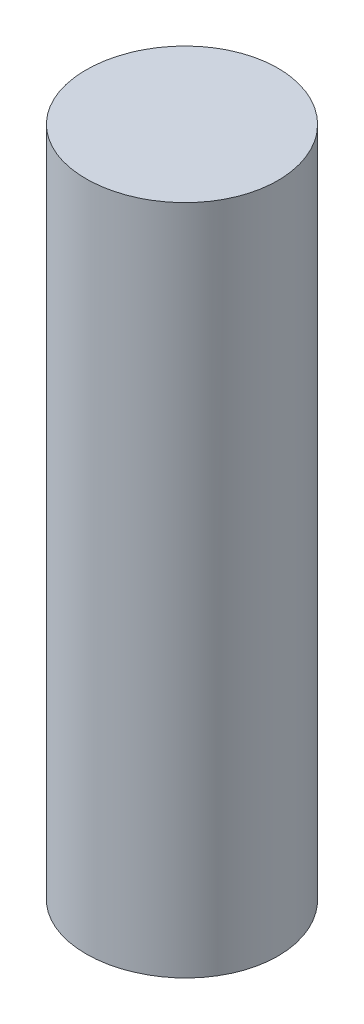
ISO-10303-21;
HEADER;
FILE_DESCRIPTION(('STEP AP214'),'2;1');
FILE_NAME('part.step','',(''),(''),'','','');
FILE_SCHEMA(('AUTOMOTIVE_DESIGN { 1 0 10303 214 1 1 1 1 }'));
ENDSEC;
DATA;
#1=APPLICATION_CONTEXT('core data for automotive mechanical design processes');
#2=APPLICATION_PROTOCOL_DEFINITION('international standard','automotive_design',2000,#1);
#3=PRODUCT_CONTEXT('',#1,'mechanical');
#4=PRODUCT('Part','Part','',(#3));
#5=PRODUCT_RELATED_PRODUCT_CATEGORY('part','',(#4));
#6=PRODUCT_DEFINITION_FORMATION('','',#4);
#7=PRODUCT_DEFINITION_CONTEXT('part definition',#1,'design');
#8=PRODUCT_DEFINITION('design','',#6,#7);
#9=PRODUCT_DEFINITION_SHAPE('','',#8);
#10=(LENGTH_UNIT() NAMED_UNIT(*) SI_UNIT(.MILLI.,.METRE.));
#11=(NAMED_UNIT(*) PLANE_ANGLE_UNIT() SI_UNIT($,.RADIAN.));
#12=(NAMED_UNIT(*) SI_UNIT($,.STERADIAN.) SOLID_ANGLE_UNIT());
#13=UNCERTAINTY_MEASURE_WITH_UNIT(LENGTH_MEASURE(1.E-05),#10,'distance_accuracy_value','');
#14=(GEOMETRIC_REPRESENTATION_CONTEXT(3) GLOBAL_UNCERTAINTY_ASSIGNED_CONTEXT((#13)) GLOBAL_UNIT_ASSIGNED_CONTEXT((#10,
#11,#12)) REPRESENTATION_CONTEXT('',''));
#15=CARTESIAN_POINT('',(0.,0.,0.));
#16=DIRECTION('',(0.,0.,1.));
#17=DIRECTION('',(1.,0.,0.));
#18=AXIS2_PLACEMENT_3D('',#15,#16,#17);
#19=CARTESIAN_POINT('',(0.,6.35,0.));
#20=DIRECTION('',(0.,-1.,0.));
#21=DIRECTION('',(0.,0.,-1.));
#22=AXIS2_PLACEMENT_3D('',#19,#20,#21);
#23=CYLINDRICAL_SURFACE('',#22,1.5875);
#24=CARTESIAN_POINT('',(0.,-5.47106576891905,-1.5875));
#25=CARTESIAN_POINT('',(-0.0891323258774931,-5.4710661953847,-1.58749605921527));
#26=CARTESIAN_POINT('',(-0.178328373062082,-5.47136925503878,-1.57996811463678));
#27=CARTESIAN_POINT('',(-0.354261339120677,-5.47254908556975,-1.55004358341553));
#28=CARTESIAN_POINT('',(-0.440995210390261,-5.47342653764656,-1.52762934192887));
#29=CARTESIAN_POINT('',(-0.609429708186872,-5.47565580852243,-1.46857367120603));
#30=CARTESIAN_POINT('',(-0.691132818553821,-5.47700739098507,-1.43193932919538));
#31=CARTESIAN_POINT('',(-0.847207157341417,-5.48003256982366,-1.34549385962703));
#32=CARTESIAN_POINT('',(-0.921580143809968,-5.48170608870116,-1.29568590222098));
#33=CARTESIAN_POINT('',(-1.0609575729247,-5.48518808834423,-1.18426756590865));
#34=CARTESIAN_POINT('',(-1.12595633295991,-5.48699664997237,-1.12265008038632));
#35=CARTESIAN_POINT('',(-1.24469203792854,-5.49054419499562,-0.989375322308569));
#36=CARTESIAN_POINT('',(-1.29842852936165,-5.4922831755866,-0.917717645656283));
#37=CARTESIAN_POINT('',(-1.39312750623152,-5.49549596912407,-0.766369973205105));
#38=CARTESIAN_POINT('',(-1.43408593057142,-5.49696969770592,-0.686677434410227));
#39=CARTESIAN_POINT('',(-1.50203994471335,-5.49948490244047,-0.521540196848319));
#40=CARTESIAN_POINT('',(-1.5290356123334,-5.50052638100219,-0.436095530142374));
#41=CARTESIAN_POINT('',(-1.56828381413217,-5.50205896658109,-0.26192837544394));
#42=CARTESIAN_POINT('',(-1.58054430220603,-5.50255037051293,-0.173207682499411));
#43=CARTESIAN_POINT('',(-1.58999864063167,-5.50292828793691,0.00503382120450027));
#44=CARTESIAN_POINT('',(-1.58719257681864,-5.50281480487513,0.094554627402681));
#45=CARTESIAN_POINT('',(-1.56660012583029,-5.50199602179352,0.271801198627353));
#46=CARTESIAN_POINT('',(-1.54882232954296,-5.50129106116864,0.359527963525134));
#47=CARTESIAN_POINT('',(-1.49880436242438,-5.49936932119253,0.530750951427133));
#48=CARTESIAN_POINT('',(-1.46656414691993,-5.49815254026033,0.614247161362635));
#49=CARTESIAN_POINT('',(-1.38852668021346,-5.4953439235059,0.774666575881291));
#50=CARTESIAN_POINT('',(-1.34272550017995,-5.49375197902002,0.851587867269614));
#51=CARTESIAN_POINT('',(-1.23886911579442,-5.49037259294969,0.996652982504264));
#52=CARTESIAN_POINT('',(-1.18081385784178,-5.48858515051013,1.06479676795476));
#53=CARTESIAN_POINT('',(-1.0540487507184,-5.48501474101618,1.1904225394974));
#54=CARTESIAN_POINT('',(-0.985331457829304,-5.48323177797963,1.24789701474509));
#55=CARTESIAN_POINT('',(-0.839219123991982,-5.4798725137363,1.35049482914136));
#56=CARTESIAN_POINT('',(-0.761824081356906,-5.4782962125697,1.39561816588902));
#57=CARTESIAN_POINT('',(-0.600548934266492,-5.47552790448338,1.472232033529));
#58=CARTESIAN_POINT('',(-0.516668712048958,-5.4743359045441,1.50372231679474));
#59=CARTESIAN_POINT('',(-0.344806165353392,-5.4724706620772,1.55217133901291));
#60=CARTESIAN_POINT('',(-0.256823860590643,-5.47179741705663,1.56913014779841));
#61=CARTESIAN_POINT('',(-0.0793198823552414,-5.47104588844171,1.58802559556648));
#62=CARTESIAN_POINT('',(0.0102006832953817,-5.47096719329646,1.58997262580849));
#63=CARTESIAN_POINT('',(0.18829734385793,-5.47141254314537,1.57881634369016));
#64=CARTESIAN_POINT('',(0.276873440750539,-5.47193658687524,1.56571306289871));
#65=CARTESIAN_POINT('',(0.450537780388072,-5.47352810495725,1.52483671281243));
#66=CARTESIAN_POINT('',(0.535627138158722,-5.47459540409278,1.49706837334254));
#67=CARTESIAN_POINT('',(0.699936913427022,-5.47715321098551,1.42765494253361));
#68=CARTESIAN_POINT('',(0.779157309464713,-5.47864372029008,1.38600980045688));
#69=CARTESIAN_POINT('',(0.929528166863688,-5.48188116785391,1.28999822370709));
#70=CARTESIAN_POINT('',(1.0006741674336,-5.48362824664709,1.23562480746434));
#71=CARTESIAN_POINT('',(1.13283183741694,-5.48718152935588,1.11571037222978));
#72=CARTESIAN_POINT('',(1.19384346387397,-5.48898773352207,1.05016930590423));
#73=CARTESIAN_POINT('',(1.30403532056128,-5.49245683691244,0.909735431766898));
#74=CARTESIAN_POINT('',(1.35320883848945,-5.49411965449396,0.834837354838984));
#75=CARTESIAN_POINT('',(1.43828275214281,-5.49711321393934,0.677842287196876));
#76=CARTESIAN_POINT('',(1.47418319001796,-5.49844395685772,0.595745319344494));
#77=CARTESIAN_POINT('',(1.53168011688411,-5.50062273584745,0.426707995464268));
#78=CARTESIAN_POINT('',(1.55328092050348,-5.50147091751113,0.339769108979754));
#79=CARTESIAN_POINT('',(1.58157953842669,-5.50258934632029,0.163495138743641));
#80=CARTESIAN_POINT('',(1.58827739705697,-5.50285959518473,0.0741600621199287));
#81=CARTESIAN_POINT('',(1.58657950993146,-5.50279163481582,-0.104303452493519));
#82=CARTESIAN_POINT('',(1.57819433321567,-5.50245385164479,-0.193431991392858));
#83=CARTESIAN_POINT('',(1.54659019576079,-5.50120880064999,-0.369015026084692));
#84=CARTESIAN_POINT('',(1.52337120605294,-5.50030153171409,-0.455469516654726));
#85=CARTESIAN_POINT('',(1.4627604501164,-5.49801986167054,-0.623253215110571));
#86=CARTESIAN_POINT('',(1.42536849196144,-5.49664545423707,-0.704582353572936));
#87=CARTESIAN_POINT('',(1.33747562256508,-5.49358448387401,-0.859808070470831));
#88=CARTESIAN_POINT('',(1.28697515388013,-5.4918979314833,-0.933704899711736));
#89=CARTESIAN_POINT('',(1.17426303570716,-5.48840148176954,-1.07201980158554));
#90=CARTESIAN_POINT('',(1.11204445662019,-5.48659151186866,-1.13643222517297));
#91=CARTESIAN_POINT('',(0.977658623094273,-5.48305256710901,-1.25391629303237));
#92=CARTESIAN_POINT('',(0.905488916090887,-5.4813236123585,-1.30698513330576));
#93=CARTESIAN_POINT('',(0.753208875800006,-5.47814070527454,-1.40029147715819));
#94=CARTESIAN_POINT('',(0.673092370448732,-5.47668696928542,-1.44051890324474));
#95=CARTESIAN_POINT('',(0.507297820972486,-5.47422187863695,-1.50690438290957));
#96=CARTESIAN_POINT('',(0.42162651764877,-5.4732099989068,-1.53307914422237));
#97=CARTESIAN_POINT('',(0.27951490632946,-5.47201185574493,-1.56371068002705));
#98=CARTESIAN_POINT('',(0.223996195039521,-5.4716586212143,-1.57262037831992));
#99=CARTESIAN_POINT('',(0.112326759412206,-5.47118544347267,-1.58451627857488));
#100=CARTESIAN_POINT('',(0.056176035411977,-5.47106550013722,-1.58750248369669));
#101=CARTESIAN_POINT('',(0.,-5.47106576891905,-1.5875));
#102=B_SPLINE_CURVE_WITH_KNOTS('',3,(#24,#25,#26,#27,#28,#29,#30,#31,#32,#33,#34,#35,#36,#37,
#38,#39,#40,#41,#42,#43,#44,#45,#46,#47,#48,#49,#50,#51,#52,#53,#54,#55,#56,#57,#58,#59,#60,#61,
#62,#63,#64,#65,#66,#67,#68,#69,#70,#71,#72,#73,#74,#75,#76,#77,#78,#79,#80,#81,#82,#83,#84,#85,
#86,#87,#88,#89,#90,#91,#92,#93,#94,#95,#96,#97,#98,#99,#100,#101),.UNSPECIFIED.,.T.,.F.,(4,2,2,
2,2,2,2,2,2,2,2,2,2,2,2,2,2,2,2,2,2,2,2,2,2,2,2,2,2,2,2,2,2,2,2,2,2,2,4),(0.,0.267191921880595,
0.53470129514145,0.802077513929601,1.06938944868147,1.33686275160949,1.60434682287689,
1.87191581893695,2.13948332375019,2.40690633347265,2.67432781966914,2.94159596195959,
3.20886492982458,3.47621140574061,3.74355905108239,4.01109419254605,4.27862938601545,
4.546169438708,4.81370820569156,5.08106176380442,5.34841476112869,5.61568158346089,
5.88294938301063,6.15036412621775,6.41778000288238,6.68534715123734,6.95291344989917,
7.22039897894511,7.48788371239685,7.75518108597247,8.02247898155131,8.28978049693106,
8.55707298911716,8.8245240460208,9.09204113738064,9.35976765360668,9.62717515094735,
9.79557410973322,9.96397297869114),.UNSPECIFIED.);
#103=CARTESIAN_POINT('',(0.,-5.47106576891905,-1.5875));
#104=VERTEX_POINT('',#103);
#105=EDGE_CURVE('E42',#104,#104,#102,.T.);
#106=ORIENTED_EDGE('',*,*,#105,.T.);
#107=EDGE_LOOP('',(#106));
#108=FACE_BOUND('',#107,.T.);
#109=CARTESIAN_POINT('',(0.,5.64143423108095,-1.5875));
#110=CARTESIAN_POINT('',(-0.0891472227091298,5.64143389700606,-1.58749605384575));
#111=CARTESIAN_POINT('',(-0.178358531416035,5.64119705168005,-1.57996560270597));
#112=CARTESIAN_POINT('',(-0.354322621602258,5.64027499755902,-1.55003053482712));
#113=CARTESIAN_POINT('',(-0.441072339214219,5.63958925355405,-1.52760816238043));
#114=CARTESIAN_POINT('',(-0.609538608616136,5.6378470586512,-1.46852962512226));
#115=CARTESIAN_POINT('',(-0.691257604803718,5.63679078948741,-1.43188043729955));
#116=CARTESIAN_POINT('',(-0.847360570200964,5.63442668036045,-1.34539864687026));
#117=CARTESIAN_POINT('',(-0.921746321098931,5.63311890173309,-1.29556925742071));
#118=CARTESIAN_POINT('',(-1.06112999886116,5.63039831553276,-1.18411348452734));
#119=CARTESIAN_POINT('',(-1.12612406987031,5.62898546518,-1.1224822797307));
#120=CARTESIAN_POINT('',(-1.2448469698967,5.62621434927114,-0.989180886735494));
#121=CARTESIAN_POINT('',(-1.29857534971464,5.62485608589335,-0.917510298424427));
#122=CARTESIAN_POINT('',(-1.39324819942624,5.62234709069276,-0.766149697102834));
#123=CARTESIAN_POINT('',(-1.43419028659637,5.62119639756749,-0.6864581930502));
#124=CARTESIAN_POINT('',(-1.50211287298196,5.61923270763166,-0.521328524483439));
#125=CARTESIAN_POINT('',(-1.52909343058499,5.61841970940886,-0.435890384003614));
#126=CARTESIAN_POINT('',(-1.56831860392433,5.61722340064628,-0.261722466611033));
#127=CARTESIAN_POINT('',(-1.58056806530615,5.6168399488144,-0.172993781994894));
#128=CARTESIAN_POINT('',(-1.58999825750972,5.61654554406182,0.00526127880553568));
#129=CARTESIAN_POINT('',(-1.58717905129446,5.61663458916684,0.0947876516552008));
#130=CARTESIAN_POINT('',(-1.56655602779887,5.61727500528725,0.272063887585355));
#131=CARTESIAN_POINT('',(-1.54875744873293,5.61782621468576,0.359814360705937));
#132=CARTESIAN_POINT('',(-1.49868901929855,5.61932856782617,0.531081269815768));
#133=CARTESIAN_POINT('',(-1.46641913566686,5.62027971248734,0.614597696072289));
#134=CARTESIAN_POINT('',(-1.38831811218727,5.6224749018511,0.775042633642645));
#135=CARTESIAN_POINT('',(-1.34248457205373,5.6237189983878,0.851969975812996));
#136=CARTESIAN_POINT('',(-1.23855906539336,5.62635979146526,0.997040230106411));
#137=CARTESIAN_POINT('',(-1.18046706805654,5.62775648838956,1.06518312015023));
#138=CARTESIAN_POINT('',(-1.05364403841481,5.63054575358149,1.19078065734568));
#139=CARTESIAN_POINT('',(-0.984908464102255,5.63193831982664,1.2482307183172));
#140=CARTESIAN_POINT('',(-0.838765455997001,5.6345617639558,1.35077648312527));
#141=CARTESIAN_POINT('',(-0.76135802077076,5.6357926418131,1.39587218491951));
#142=CARTESIAN_POINT('',(-0.600066059575804,5.63795397618172,1.47242861406457));
#143=CARTESIAN_POINT('',(-0.516181464766448,5.63888442949954,1.50388919647491));
#144=CARTESIAN_POINT('',(-0.344317522119927,5.64033997860413,1.55227940057071));
#145=CARTESIAN_POINT('',(-0.256338186362789,5.64086507558668,1.56920906512144));
#146=CARTESIAN_POINT('',(-0.0788220334055555,5.64145056829055,1.58805123908148));
#147=CARTESIAN_POINT('',(0.0107141096392611,5.64151116037235,1.58997009402769));
#148=CARTESIAN_POINT('',(0.188837259451987,5.64116133334829,1.57875271667914));
#149=CARTESIAN_POINT('',(0.277424267417047,5.64075091483659,1.5656165033757));
#150=CARTESIAN_POINT('',(0.45111677851136,5.6395054465374,1.52466713161469));
#151=CARTESIAN_POINT('',(0.536222961718727,5.63867048012975,1.49685685505561));
#152=CARTESIAN_POINT('',(0.700558842557264,5.63667000024061,1.42735171626964));
#153=CARTESIAN_POINT('',(0.779788527324965,5.6355044860356,1.38565682365085));
#154=CARTESIAN_POINT('',(0.930151566087395,5.63297370941213,1.28954968760029));
#155=CARTESIAN_POINT('',(1.00128218988594,5.63160837998827,1.23513317446887));
#156=CARTESIAN_POINT('',(1.13340054318113,5.62883206356422,1.11513375274292));
#157=CARTESIAN_POINT('',(1.19438824489454,5.62742107643897,1.04955081356259));
#158=CARTESIAN_POINT('',(1.3045107278408,5.62471194902919,0.909053006760292));
#159=CARTESIAN_POINT('',(1.35364141388802,5.62341384783203,0.834134928468157));
#160=CARTESIAN_POINT('',(1.43862722361548,5.62107746403274,0.677109875001655));
#161=CARTESIAN_POINT('',(1.47448237854415,5.62003918081904,0.5950029167493));
#162=CARTESIAN_POINT('',(1.53189215707859,5.61833977757046,0.425946225881764));
#163=CARTESIAN_POINT('',(1.55344942875594,5.61767858769834,0.338997393252113));
#164=CARTESIAN_POINT('',(1.58166018887617,5.61680772321036,0.162712368892074));
#165=CARTESIAN_POINT('',(1.58831369384498,5.61659804809384,0.0733761798090003));
#166=CARTESIAN_POINT('',(1.58652774761861,5.61665387873925,-0.105106654055321));
#167=CARTESIAN_POINT('',(1.57809475400102,5.61691918119332,-0.194253363589159));
#168=CARTESIAN_POINT('',(1.54638847718434,5.6178946318505,-0.36986500877741));
#169=CARTESIAN_POINT('',(1.52311516461022,5.61860478093416,-0.456329939123133));
#170=CARTESIAN_POINT('',(1.4623898263635,5.62038983789378,-0.624125959502744));
#171=CARTESIAN_POINT('',(1.42493756778123,5.62146475176149,-0.705456965178891));
#172=CARTESIAN_POINT('',(1.33691956430579,5.62385811750901,-0.860675271242105));
#173=CARTESIAN_POINT('',(1.28635429018471,5.62517656064535,-0.934562838724824));
#174=CARTESIAN_POINT('',(1.17352612196722,5.62790893560818,-1.07282684915353));
#175=CARTESIAN_POINT('',(1.11125947359123,5.62932289798763,-1.13720022768358));
#176=CARTESIAN_POINT('',(0.97678461992554,5.63208695879608,-1.254597603108));
#177=CARTESIAN_POINT('',(0.904573957565854,5.63343704132985,-1.30761878668649));
#178=CARTESIAN_POINT('',(0.752231274964402,5.63592164674268,-1.40081644969551));
#179=CARTESIAN_POINT('',(0.672094035333731,5.63705602613248,-1.44098439098515));
#180=CARTESIAN_POINT('',(0.506271394802178,5.63897881538108,-1.50724896901166));
#181=CARTESIAN_POINT('',(0.420592744213204,5.63976763740166,-1.5333623777702));
#182=CARTESIAN_POINT('',(0.278644414367798,5.64069970844315,-1.56385971761581));
#183=CARTESIAN_POINT('',(0.223296004663052,5.64097395854902,-1.57271366100487));
#184=CARTESIAN_POINT('',(0.111973492498049,5.6413413247664,-1.58453504067723));
#185=CARTESIAN_POINT('',(0.0559993902382042,5.64143444093594,-1.58750247884595));
#186=CARTESIAN_POINT('',(0.,5.64143423108095,-1.5875));
#187=B_SPLINE_CURVE_WITH_KNOTS('',3,(#109,#110,#111,#112,#113,#114,#115,#116,#117,#118,#119,
#120,#121,#122,#123,#124,#125,#126,#127,#128,#129,#130,#131,#132,#133,#134,#135,#136,#137,#138,
#139,#140,#141,#142,#143,#144,#145,#146,#147,#148,#149,#150,#151,#152,#153,#154,#155,#156,#157,
#158,#159,#160,#161,#162,#163,#164,#165,#166,#167,#168,#169,#170,#171,#172,#173,#174,#175,#176,
#177,#178,#179,#180,#181,#182,#183,#184,#185,#186),.UNSPECIFIED.,.T.,.F.,(4,2,2,2,2,2,2,2,2,2,2,
2,2,2,2,2,2,2,2,2,2,2,2,2,2,2,2,2,2,2,2,2,2,2,2,2,2,2,4),(0.,0.267237262425161,
0.534793726475732,0.802219143283613,1.06957942534027,1.33704916504409,1.60452956759866,
1.87205978538115,2.13958888433482,2.40702995819812,2.67446991458514,2.94181638735085,
3.20916347463323,3.47655790117858,3.7439529997922,4.01146252184754,4.27897208812503,
4.546484497943,4.81399611861395,5.08139464767397,5.34879283942265,5.61613853529738,
5.88348481636617,6.15092095479596,6.41835782576806,6.68588693253567,6.9534154095795,
7.22089432456475,7.48837294295782,7.755737098033,8.02310178233246,8.29047085867391,
8.55783033749169,8.82527574307474,9.09278735081033,9.36047629379424,9.62784507700431,
9.79571490046246,9.96358467015304),.UNSPECIFIED.);
#188=CARTESIAN_POINT('',(0.,5.64143423108095,-1.5875));
#189=VERTEX_POINT('',#188);
#190=EDGE_CURVE('E11',#189,#189,#187,.T.);
#191=ORIENTED_EDGE('',*,*,#190,.F.);
#192=EDGE_LOOP('',(#191));
#193=FACE_BOUND('',#192,.T.);
#194=ADVANCED_FACE('F32',(#108,#193),#23,.T.);
#195=CARTESIAN_POINT('',(0.,-45.1585657689191,-1.5875));
#196=DIRECTION('',(0.,0.,1.));
#197=DIRECTION('',(1.,0.,0.));
#198=AXIS2_PLACEMENT_3D('',#195,#196,#197);
#199=CYLINDRICAL_SURFACE('',#198,39.6875);
#200=ORIENTED_EDGE('',*,*,#105,.F.);
#201=EDGE_LOOP('',(#200));
#202=FACE_BOUND('',#201,.T.);
#203=ADVANCED_FACE('F50',(#202),#199,.F.);
#204=CARTESIAN_POINT('',(0.,-45.1585657689191,-1.5875));
#205=DIRECTION('',(0.,0.,1.));
#206=DIRECTION('',(1.,0.,0.));
#207=AXIS2_PLACEMENT_3D('',#204,#205,#206);
#208=CYLINDRICAL_SURFACE('',#207,50.8);
#209=ORIENTED_EDGE('',*,*,#190,.T.);
#210=EDGE_LOOP('',(#209));
#211=FACE_BOUND('',#210,.T.);
#212=ADVANCED_FACE('F53',(#211),#208,.T.);
#213=CLOSED_SHELL('',(#194,#203,#212));
#214=MANIFOLD_SOLID_BREP('B2',#213);
#215=ADVANCED_BREP_SHAPE_REPRESENTATION('',(#18,#214),#14);
#216=SHAPE_DEFINITION_REPRESENTATION(#9,#215);
ENDSEC;
END-ISO-10303-21;
